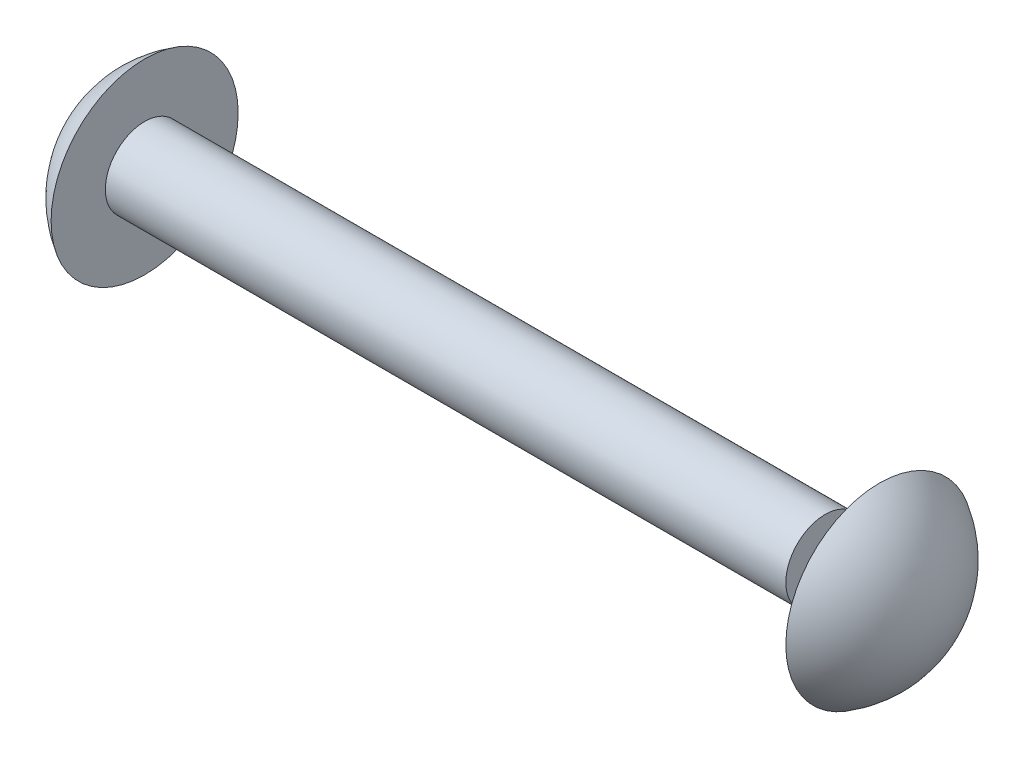
ISO-10303-21;
HEADER;
FILE_DESCRIPTION(('STEP AP214'),'2;1');
FILE_NAME('part.step','',(''),(''),'','','');
FILE_SCHEMA(('AUTOMOTIVE_DESIGN { 1 0 10303 214 1 1 1 1 }'));
ENDSEC;
DATA;
#1=APPLICATION_CONTEXT('core data for automotive mechanical design processes');
#2=APPLICATION_PROTOCOL_DEFINITION('international standard','automotive_design',2000,#1);
#3=PRODUCT_CONTEXT('',#1,'mechanical');
#4=PRODUCT('Part','Part','',(#3));
#5=PRODUCT_RELATED_PRODUCT_CATEGORY('part','',(#4));
#6=PRODUCT_DEFINITION_FORMATION('','',#4);
#7=PRODUCT_DEFINITION_CONTEXT('part definition',#1,'design');
#8=PRODUCT_DEFINITION('design','',#6,#7);
#9=PRODUCT_DEFINITION_SHAPE('','',#8);
#10=(LENGTH_UNIT() NAMED_UNIT(*) SI_UNIT(.MILLI.,.METRE.));
#11=(NAMED_UNIT(*) PLANE_ANGLE_UNIT() SI_UNIT($,.RADIAN.));
#12=(NAMED_UNIT(*) SI_UNIT($,.STERADIAN.) SOLID_ANGLE_UNIT());
#13=UNCERTAINTY_MEASURE_WITH_UNIT(LENGTH_MEASURE(1.E-05),#10,'distance_accuracy_value','');
#14=(GEOMETRIC_REPRESENTATION_CONTEXT(3) GLOBAL_UNCERTAINTY_ASSIGNED_CONTEXT((#13)) GLOBAL_UNIT_ASSIGNED_CONTEXT((#10,
#11,#12)) REPRESENTATION_CONTEXT('',''));
#15=CARTESIAN_POINT('',(0.,0.,0.));
#16=DIRECTION('',(0.,0.,1.));
#17=DIRECTION('',(1.,0.,0.));
#18=AXIS2_PLACEMENT_3D('',#15,#16,#17);
#19=CARTESIAN_POINT('',(12.574375,0.,0.));
#20=DIRECTION('',(-1.,0.,0.));
#21=DIRECTION('',(0.,-1.,0.));
#22=AXIS2_PLACEMENT_3D('',#19,#20,#21);
#23=SPHERICAL_SURFACE('',#22,3.975625);
#24=CARTESIAN_POINT('',(14.55,0.,0.));
#25=DIRECTION('',(-1.,0.,0.));
#26=DIRECTION('',(0.,0.,-1.));
#27=AXIS2_PLACEMENT_3D('',#24,#25,#26);
#28=CIRCLE('',#27,3.45);
#29=CARTESIAN_POINT('',(14.55,0.,-3.45));
#30=VERTEX_POINT('',#29);
#31=EDGE_CURVE('E11',#30,#30,#28,.T.);
#32=ORIENTED_EDGE('',*,*,#31,.F.);
#33=EDGE_LOOP('',(#32));
#34=FACE_BOUND('',#33,.T.);
#35=ADVANCED_FACE('F52',(#34),#23,.T.);
#36=CARTESIAN_POINT('',(14.55,-3.45,0.));
#37=DIRECTION('',(-1.,0.,0.));
#38=DIRECTION('',(0.,0.,-1.));
#39=AXIS2_PLACEMENT_3D('',#36,#37,#38);
#40=PLANE('',#39);
#41=ORIENTED_EDGE('',*,*,#31,.T.);
#42=EDGE_LOOP('',(#41));
#43=FACE_BOUND('',#42,.T.);
#44=ADVANCED_FACE('F59',(#43),#40,.T.);
#45=CLOSED_SHELL('',(#35,#44));
#46=MANIFOLD_SOLID_BREP('B2',#45);
#47=CARTESIAN_POINT('',(-10.574375,0.,0.));
#48=DIRECTION('',(1.,0.,0.));
#49=DIRECTION('',(0.,1.,0.));
#50=AXIS2_PLACEMENT_3D('',#47,#48,#49);
#51=SPHERICAL_SURFACE('',#50,3.975625);
#52=CARTESIAN_POINT('',(-12.55,0.,0.));
#53=DIRECTION('',(1.,0.,0.));
#54=DIRECTION('',(0.,0.,-1.));
#55=AXIS2_PLACEMENT_3D('',#52,#53,#54);
#56=CIRCLE('',#55,3.45);
#57=CARTESIAN_POINT('',(-12.55,0.,-3.45));
#58=VERTEX_POINT('',#57);
#59=EDGE_CURVE('E51',#58,#58,#56,.T.);
#60=ORIENTED_EDGE('',*,*,#59,.F.);
#61=EDGE_LOOP('',(#60));
#62=FACE_BOUND('',#61,.T.);
#63=ADVANCED_FACE('F85',(#62),#51,.T.);
#64=CARTESIAN_POINT('',(-12.55,3.45,0.));
#65=DIRECTION('',(1.,0.,0.));
#66=DIRECTION('',(0.,0.,-1.));
#67=AXIS2_PLACEMENT_3D('',#64,#65,#66);
#68=PLANE('',#67);
#69=ORIENTED_EDGE('',*,*,#59,.T.);
#70=EDGE_LOOP('',(#69));
#71=FACE_BOUND('',#70,.T.);
#72=ADVANCED_FACE('F92',(#71),#68,.T.);
#73=CLOSED_SHELL('',(#63,#72));
#74=MANIFOLD_SOLID_BREP('B6',#73);
#75=CARTESIAN_POINT('',(12.55,0.,0.));
#76=DIRECTION('',(-1.,0.,0.));
#77=DIRECTION('',(0.,0.,1.));
#78=AXIS2_PLACEMENT_3D('',#75,#76,#77);
#79=CYLINDRICAL_SURFACE('',#78,1.45);
#80=CARTESIAN_POINT('',(12.55,0.,0.));
#81=DIRECTION('',(1.,0.,0.));
#82=DIRECTION('',(0.,0.,-1.));
#83=AXIS2_PLACEMENT_3D('',#80,#81,#82);
#84=CIRCLE('',#83,1.45);
#85=CARTESIAN_POINT('',(12.55,0.,-1.45));
#86=VERTEX_POINT('',#85);
#87=EDGE_CURVE('E84',#86,#86,#84,.T.);
#88=ORIENTED_EDGE('',*,*,#87,.F.);
#89=EDGE_LOOP('',(#88));
#90=FACE_BOUND('',#89,.T.);
#91=CARTESIAN_POINT('',(-12.55,0.,0.));
#92=DIRECTION('',(1.,0.,0.));
#93=DIRECTION('',(0.,0.,-1.));
#94=AXIS2_PLACEMENT_3D('',#91,#92,#93);
#95=CIRCLE('',#94,1.45);
#96=CARTESIAN_POINT('',(-12.55,0.,-1.45));
#97=VERTEX_POINT('',#96);
#98=EDGE_CURVE('E114',#97,#97,#95,.T.);
#99=ORIENTED_EDGE('',*,*,#98,.T.);
#100=EDGE_LOOP('',(#99));
#101=FACE_BOUND('',#100,.T.);
#102=ADVANCED_FACE('F111',(#90,#101),#79,.T.);
#103=CARTESIAN_POINT('',(12.55,0.,0.));
#104=DIRECTION('',(1.,0.,0.));
#105=DIRECTION('',(0.,0.,-1.));
#106=AXIS2_PLACEMENT_3D('',#103,#104,#105);
#107=PLANE('',#106);
#108=ORIENTED_EDGE('',*,*,#87,.T.);
#109=EDGE_LOOP('',(#108));
#110=FACE_BOUND('',#109,.T.);
#111=ADVANCED_FACE('F128',(#110),#107,.T.);
#112=CARTESIAN_POINT('',(-12.55,0.,0.));
#113=DIRECTION('',(1.,0.,0.));
#114=DIRECTION('',(0.,0.,-1.));
#115=AXIS2_PLACEMENT_3D('',#112,#113,#114);
#116=PLANE('',#115);
#117=ORIENTED_EDGE('',*,*,#98,.F.);
#118=EDGE_LOOP('',(#117));
#119=FACE_BOUND('',#118,.T.);
#120=ADVANCED_FACE('F126',(#119),#116,.F.);
#121=CLOSED_SHELL('',(#102,#111,#120));
#122=MANIFOLD_SOLID_BREP('B46',#121);
#123=ADVANCED_BREP_SHAPE_REPRESENTATION('',(#18,#46,#74,#122),#14);
#124=SHAPE_DEFINITION_REPRESENTATION(#9,#123);
ENDSEC;
END-ISO-10303-21;
